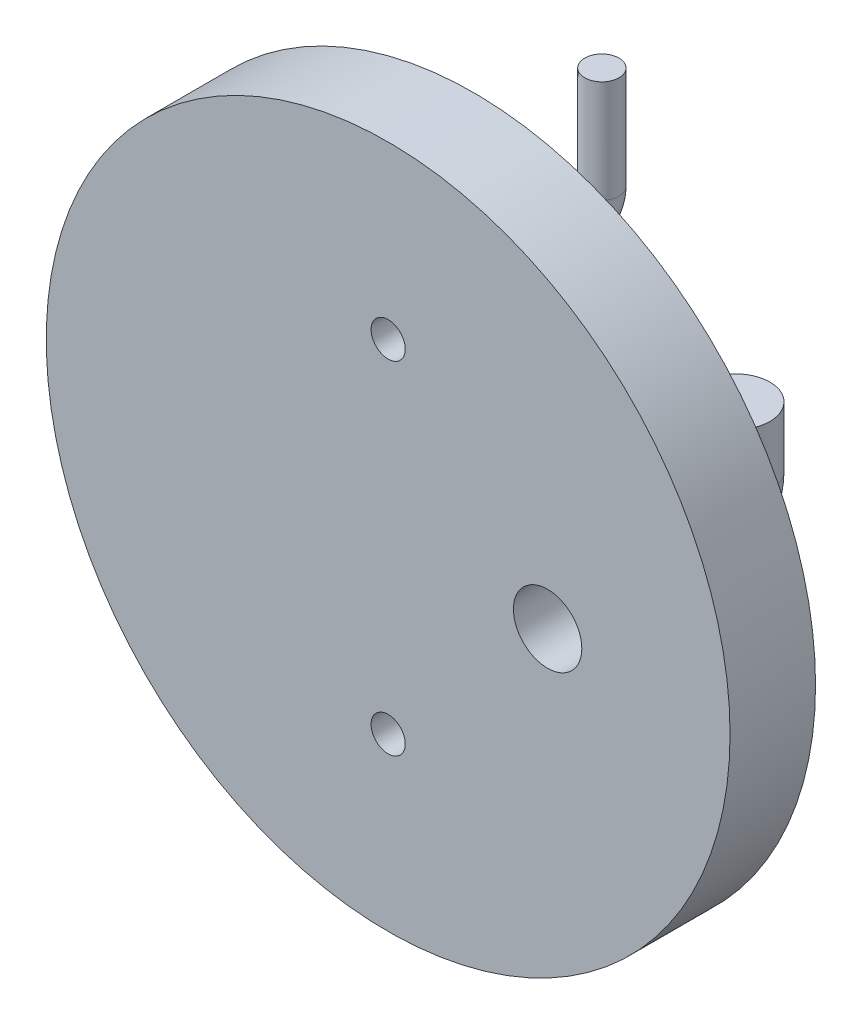
ISO-10303-21;
HEADER;
FILE_DESCRIPTION(('STEP AP214'),'2;1');
FILE_NAME('part.step','',(''),(''),'','','');
FILE_SCHEMA(('AUTOMOTIVE_DESIGN { 1 0 10303 214 1 1 1 1 }'));
ENDSEC;
DATA;
#1=APPLICATION_CONTEXT('core data for automotive mechanical design processes');
#2=APPLICATION_PROTOCOL_DEFINITION('international standard','automotive_design',2000,#1);
#3=PRODUCT_CONTEXT('',#1,'mechanical');
#4=PRODUCT('Part','Part','',(#3));
#5=PRODUCT_RELATED_PRODUCT_CATEGORY('part','',(#4));
#6=PRODUCT_DEFINITION_FORMATION('','',#4);
#7=PRODUCT_DEFINITION_CONTEXT('part definition',#1,'design');
#8=PRODUCT_DEFINITION('design','',#6,#7);
#9=PRODUCT_DEFINITION_SHAPE('','',#8);
#10=(LENGTH_UNIT() NAMED_UNIT(*) SI_UNIT(.MILLI.,.METRE.));
#11=(NAMED_UNIT(*) PLANE_ANGLE_UNIT() SI_UNIT($,.RADIAN.));
#12=(NAMED_UNIT(*) SI_UNIT($,.STERADIAN.) SOLID_ANGLE_UNIT());
#13=UNCERTAINTY_MEASURE_WITH_UNIT(LENGTH_MEASURE(1.E-05),#10,'distance_accuracy_value','');
#14=(GEOMETRIC_REPRESENTATION_CONTEXT(3) GLOBAL_UNCERTAINTY_ASSIGNED_CONTEXT((#13)) GLOBAL_UNIT_ASSIGNED_CONTEXT((#10,
#11,#12)) REPRESENTATION_CONTEXT('',''));
#15=CARTESIAN_POINT('',(0.,0.,0.));
#16=DIRECTION('',(0.,0.,1.));
#17=DIRECTION('',(1.,0.,0.));
#18=AXIS2_PLACEMENT_3D('',#15,#16,#17);
#19=CARTESIAN_POINT('',(18.6528025804478,5.00000000000004,-12.));
#20=DIRECTION('',(0.,1.,0.));
#21=DIRECTION('',(0.,0.,1.));
#22=AXIS2_PLACEMENT_3D('',#19,#20,#21);
#23=CYLINDRICAL_SURFACE('',#22,4.);
#24=CARTESIAN_POINT('',(18.6528025804478,5.00000000000004,-12.));
#25=DIRECTION('',(0.,-1.,0.));
#26=DIRECTION('',(1.,0.,0.));
#27=AXIS2_PLACEMENT_3D('',#24,#25,#26);
#28=CIRCLE('',#27,4.);
#29=CARTESIAN_POINT('',(18.6528025804478,5.00000000000007,-16.));
#30=VERTEX_POINT('',#29);
#31=EDGE_CURVE('E45',#30,#30,#28,.T.);
#32=ORIENTED_EDGE('',*,*,#31,.F.);
#33=EDGE_LOOP('',(#32));
#34=FACE_BOUND('',#33,.T.);
#35=CARTESIAN_POINT('',(18.6528025804478,12.,-12.));
#36=DIRECTION('',(0.,-1.,0.));
#37=DIRECTION('',(1.,0.,0.));
#38=AXIS2_PLACEMENT_3D('',#35,#36,#37);
#39=CIRCLE('',#38,4.);
#40=CARTESIAN_POINT('',(22.6528025804478,12.,-12.));
#41=VERTEX_POINT('',#40);
#42=EDGE_CURVE('E11',#41,#41,#39,.T.);
#43=ORIENTED_EDGE('',*,*,#42,.T.);
#44=EDGE_LOOP('',(#43));
#45=FACE_BOUND('',#44,.T.);
#46=ADVANCED_FACE('F39',(#34,#45),#23,.T.);
#47=CARTESIAN_POINT('',(18.6528025804478,5.,-7.));
#48=DIRECTION('',(1.,0.,0.));
#49=DIRECTION('',(0.,0.,-1.));
#50=AXIS2_PLACEMENT_3D('',#47,#48,#49);
#51=TOROIDAL_SURFACE('',#50,5.,4.);
#52=CARTESIAN_POINT('',(18.6528025804478,0.,-6.99999999999996));
#53=DIRECTION('',(0.,0.,1.));
#54=DIRECTION('',(1.,0.,0.));
#55=AXIS2_PLACEMENT_3D('',#52,#53,#54);
#56=CIRCLE('',#55,4.);
#57=CARTESIAN_POINT('',(18.6528025804478,-4.,-6.99999999999994));
#58=VERTEX_POINT('',#57);
#59=EDGE_CURVE('E49',#58,#58,#56,.T.);
#60=CARTESIAN_POINT('',(18.6528025804478,5.,-7.));
#61=DIRECTION('',(1.,0.,0.));
#62=DIRECTION('',(0.,0.,-1.));
#63=AXIS2_PLACEMENT_3D('',#60,#61,#62);
#64=CIRCLE('',#63,9.);
#65=EDGE_CURVE('',#58,#30,#64,.T.);
#66=ORIENTED_EDGE('',*,*,#59,.F.);
#67=ORIENTED_EDGE('',*,*,#31,.T.);
#68=ORIENTED_EDGE('',*,*,#65,.T.);
#69=ORIENTED_EDGE('',*,*,#65,.F.);
#70=EDGE_LOOP('',(#66,#68,#67,#69));
#71=FACE_BOUND('',#70,.T.);
#72=ADVANCED_FACE('F64',(#71),#51,.T.);
#73=CARTESIAN_POINT('',(18.6528025804478,0.,-6.99999999999996));
#74=DIRECTION('',(0.,0.,1.));
#75=DIRECTION('',(1.,0.,0.));
#76=AXIS2_PLACEMENT_3D('',#73,#74,#75);
#77=CYLINDRICAL_SURFACE('',#76,4.);
#78=ORIENTED_EDGE('',*,*,#59,.T.);
#79=EDGE_LOOP('',(#78));
#80=FACE_BOUND('',#79,.T.);
#81=CARTESIAN_POINT('',(18.6528025804478,0.,0.));
#82=DIRECTION('',(0.,0.,1.));
#83=DIRECTION('',(1.,0.,0.));
#84=AXIS2_PLACEMENT_3D('',#81,#82,#83);
#85=CIRCLE('',#84,4.);
#86=CARTESIAN_POINT('',(22.6528025804478,0.,0.));
#87=VERTEX_POINT('',#86);
#88=EDGE_CURVE('E53',#87,#87,#85,.T.);
#89=ORIENTED_EDGE('',*,*,#88,.F.);
#90=EDGE_LOOP('',(#89));
#91=FACE_BOUND('',#90,.T.);
#92=ADVANCED_FACE('F61',(#80,#91),#77,.T.);
#93=CARTESIAN_POINT('',(18.6528025804478,12.,-12.));
#94=DIRECTION('',(0.,-1.,0.));
#95=DIRECTION('',(1.,0.,0.));
#96=AXIS2_PLACEMENT_3D('',#93,#94,#95);
#97=PLANE('',#96);
#98=ORIENTED_EDGE('',*,*,#42,.F.);
#99=EDGE_LOOP('',(#98));
#100=FACE_BOUND('',#99,.T.);
#101=ADVANCED_FACE('F63',(#100),#97,.F.);
#102=CARTESIAN_POINT('',(18.6528025804478,0.,0.));
#103=DIRECTION('',(0.,0.,1.));
#104=DIRECTION('',(1.,0.,0.));
#105=AXIS2_PLACEMENT_3D('',#102,#103,#104);
#106=PLANE('',#105);
#107=ORIENTED_EDGE('',*,*,#88,.T.);
#108=EDGE_LOOP('',(#107));
#109=FACE_BOUND('',#108,.T.);
#110=ADVANCED_FACE('F59',(#109),#106,.T.);
#111=CLOSED_SHELL('',(#46,#72,#92,#101,#110));
#112=MANIFOLD_SOLID_BREP('B2',#111);
#113=CARTESIAN_POINT('',(0.,23.,-15.));
#114=DIRECTION('',(0.,1.,0.));
#115=DIRECTION('',(0.,0.,1.));
#116=AXIS2_PLACEMENT_3D('',#113,#114,#115);
#117=CYLINDRICAL_SURFACE('',#116,2.);
#118=CARTESIAN_POINT('',(0.,23.,-15.));
#119=DIRECTION('',(0.,1.,0.));
#120=DIRECTION('',(-1.,0.,0.));
#121=AXIS2_PLACEMENT_3D('',#118,#119,#120);
#122=CIRCLE('',#121,2.);
#123=CARTESIAN_POINT('',(0.,23.,-17.));
#124=VERTEX_POINT('',#123);
#125=EDGE_CURVE('E123',#124,#124,#122,.T.);
#126=ORIENTED_EDGE('',*,*,#125,.T.);
#127=EDGE_LOOP('',(#126));
#128=FACE_BOUND('',#127,.T.);
#129=CARTESIAN_POINT('',(0.,35.,-15.));
#130=DIRECTION('',(0.,1.,0.));
#131=DIRECTION('',(-1.,0.,0.));
#132=AXIS2_PLACEMENT_3D('',#129,#130,#131);
#133=CIRCLE('',#132,2.);
#134=CARTESIAN_POINT('',(-2.,35.,-15.));
#135=VERTEX_POINT('',#134);
#136=EDGE_CURVE('E38',#135,#135,#133,.T.);
#137=ORIENTED_EDGE('',*,*,#136,.F.);
#138=EDGE_LOOP('',(#137));
#139=FACE_BOUND('',#138,.T.);
#140=ADVANCED_FACE('F117',(#128,#139),#117,.T.);
#141=CARTESIAN_POINT('',(0.,23.,-12.));
#142=DIRECTION('',(1.,0.,0.));
#143=DIRECTION('',(0.,0.,-1.));
#144=AXIS2_PLACEMENT_3D('',#141,#142,#143);
#145=TOROIDAL_SURFACE('',#144,3.,2.);
#146=CARTESIAN_POINT('',(0.,20.,-12.));
#147=DIRECTION('',(0.,0.,-1.));
#148=DIRECTION('',(-1.,0.,0.));
#149=AXIS2_PLACEMENT_3D('',#146,#147,#148);
#150=CIRCLE('',#149,2.);
#151=CARTESIAN_POINT('',(0.,18.,-12.));
#152=VERTEX_POINT('',#151);
#153=EDGE_CURVE('E127',#152,#152,#150,.T.);
#154=CARTESIAN_POINT('',(0.,23.,-12.));
#155=DIRECTION('',(1.,0.,0.));
#156=DIRECTION('',(0.,0.,-1.));
#157=AXIS2_PLACEMENT_3D('',#154,#155,#156);
#158=CIRCLE('',#157,5.);
#159=EDGE_CURVE('',#152,#124,#158,.T.);
#160=ORIENTED_EDGE('',*,*,#153,.T.);
#161=ORIENTED_EDGE('',*,*,#125,.F.);
#162=ORIENTED_EDGE('',*,*,#159,.T.);
#163=ORIENTED_EDGE('',*,*,#159,.F.);
#164=EDGE_LOOP('',(#160,#162,#161,#163));
#165=FACE_BOUND('',#164,.T.);
#166=ADVANCED_FACE('F149',(#165),#145,.T.);
#167=CARTESIAN_POINT('',(0.,20.,-12.));
#168=DIRECTION('',(0.,0.,1.));
#169=DIRECTION('',(0.,-1.,0.));
#170=AXIS2_PLACEMENT_3D('',#167,#168,#169);
#171=CYLINDRICAL_SURFACE('',#170,2.);
#172=CARTESIAN_POINT('',(0.,20.,0.));
#173=DIRECTION('',(0.,0.,-1.));
#174=DIRECTION('',(-1.,0.,0.));
#175=AXIS2_PLACEMENT_3D('',#172,#173,#174);
#176=CIRCLE('',#175,2.);
#177=CARTESIAN_POINT('',(0.,18.,0.));
#178=VERTEX_POINT('',#177);
#179=EDGE_CURVE('E131',#178,#178,#176,.T.);
#180=CARTESIAN_POINT('',(0.,18.,-12.));
#181=CARTESIAN_POINT('',(0.,18.,-11.875));
#182=CARTESIAN_POINT('',(0.,18.,-11.75));
#183=CARTESIAN_POINT('',(0.,18.,-11.5));
#184=CARTESIAN_POINT('',(0.,18.,-11.375));
#185=CARTESIAN_POINT('',(0.,18.,-11.125));
#186=CARTESIAN_POINT('',(0.,18.,-11.));
#187=CARTESIAN_POINT('',(0.,18.,-10.75));
#188=CARTESIAN_POINT('',(0.,18.,-10.625));
#189=CARTESIAN_POINT('',(0.,18.,-10.375));
#190=CARTESIAN_POINT('',(0.,18.,-10.25));
#191=CARTESIAN_POINT('',(0.,18.,-10.));
#192=CARTESIAN_POINT('',(0.,18.,-9.875));
#193=CARTESIAN_POINT('',(0.,18.,-9.625));
#194=CARTESIAN_POINT('',(0.,18.,-9.5));
#195=CARTESIAN_POINT('',(0.,18.,-9.25));
#196=CARTESIAN_POINT('',(0.,18.,-9.125));
#197=CARTESIAN_POINT('',(0.,18.,-8.875));
#198=CARTESIAN_POINT('',(0.,18.,-8.75));
#199=CARTESIAN_POINT('',(0.,18.,-8.5));
#200=CARTESIAN_POINT('',(0.,18.,-8.375));
#201=CARTESIAN_POINT('',(0.,18.,-8.125));
#202=CARTESIAN_POINT('',(0.,18.,-8.));
#203=CARTESIAN_POINT('',(0.,18.,-7.75));
#204=CARTESIAN_POINT('',(0.,18.,-7.625));
#205=CARTESIAN_POINT('',(0.,18.,-7.375));
#206=CARTESIAN_POINT('',(0.,18.,-7.25));
#207=CARTESIAN_POINT('',(0.,18.,-7.));
#208=CARTESIAN_POINT('',(0.,18.,-6.875));
#209=CARTESIAN_POINT('',(0.,18.,-6.625));
#210=CARTESIAN_POINT('',(0.,18.,-6.5));
#211=CARTESIAN_POINT('',(0.,18.,-6.25));
#212=CARTESIAN_POINT('',(0.,18.,-6.125));
#213=CARTESIAN_POINT('',(0.,18.,-5.875));
#214=CARTESIAN_POINT('',(0.,18.,-5.75));
#215=CARTESIAN_POINT('',(0.,18.,-5.5));
#216=CARTESIAN_POINT('',(0.,18.,-5.375));
#217=CARTESIAN_POINT('',(0.,18.,-5.125));
#218=CARTESIAN_POINT('',(0.,18.,-5.));
#219=CARTESIAN_POINT('',(0.,18.,-4.75));
#220=CARTESIAN_POINT('',(0.,18.,-4.625));
#221=CARTESIAN_POINT('',(0.,18.,-4.375));
#222=CARTESIAN_POINT('',(0.,18.,-4.25));
#223=CARTESIAN_POINT('',(0.,18.,-4.));
#224=CARTESIAN_POINT('',(0.,18.,-3.875));
#225=CARTESIAN_POINT('',(0.,18.,-3.625));
#226=CARTESIAN_POINT('',(0.,18.,-3.5));
#227=CARTESIAN_POINT('',(0.,18.,-3.25));
#228=CARTESIAN_POINT('',(0.,18.,-3.125));
#229=CARTESIAN_POINT('',(0.,18.,-2.875));
#230=CARTESIAN_POINT('',(0.,18.,-2.75));
#231=CARTESIAN_POINT('',(0.,18.,-2.5));
#232=CARTESIAN_POINT('',(0.,18.,-2.375));
#233=CARTESIAN_POINT('',(0.,18.,-2.125));
#234=CARTESIAN_POINT('',(0.,18.,-2.));
#235=CARTESIAN_POINT('',(0.,18.,-1.75));
#236=CARTESIAN_POINT('',(0.,18.,-1.625));
#237=CARTESIAN_POINT('',(0.,18.,-1.375));
#238=CARTESIAN_POINT('',(0.,18.,-1.25));
#239=CARTESIAN_POINT('',(0.,18.,-1.));
#240=CARTESIAN_POINT('',(0.,18.,-0.875000000000001));
#241=CARTESIAN_POINT('',(0.,18.,-0.625000000000001));
#242=CARTESIAN_POINT('',(0.,18.,-0.5));
#243=CARTESIAN_POINT('',(0.,18.,-0.25));
#244=CARTESIAN_POINT('',(0.,18.,-0.125));
#245=CARTESIAN_POINT('',(0.,18.,0.));
#246=B_SPLINE_CURVE_WITH_KNOTS('',3,(#180,#181,#182,#183,#184,#185,#186,#187,#188,#189,#190,
#191,#192,#193,#194,#195,#196,#197,#198,#199,#200,#201,#202,#203,#204,#205,#206,#207,#208,#209,
#210,#211,#212,#213,#214,#215,#216,#217,#218,#219,#220,#221,#222,#223,#224,#225,#226,#227,#228,
#229,#230,#231,#232,#233,#234,#235,#236,#237,#238,#239,#240,#241,#242,#243,#244,#245),
.UNSPECIFIED.,.F.,.F.,(4,2,2,2,2,2,2,2,2,2,2,2,2,2,2,2,2,2,2,2,2,2,2,2,2,2,2,2,2,2,2,2,4),(0.,
0.375,0.750000000000001,1.125,1.5,1.875,2.25,2.625,3.,3.375,3.75,4.125,4.5,4.875,5.25,5.625,6.,
6.375,6.75,7.125,7.5,7.875,8.25,8.625,9.,9.375,9.75,10.125,10.5,10.875,11.25,11.625,12.),.UNSPECIFIED.);
#247=EDGE_CURVE('BSEAM137',#152,#178,#246,.T.);
#248=ORIENTED_EDGE('',*,*,#153,.F.);
#249=ORIENTED_EDGE('',*,*,#179,.T.);
#250=ORIENTED_EDGE('',*,*,#247,.T.);
#251=ORIENTED_EDGE('',*,*,#247,.F.);
#252=EDGE_LOOP('',(#248,#250,#249,#251));
#253=FACE_BOUND('',#252,.T.);
#254=ADVANCED_FACE('F137',(#253),#171,.T.);
#255=CARTESIAN_POINT('',(0.,35.,-15.));
#256=DIRECTION('',(0.,1.,0.));
#257=DIRECTION('',(-1.,0.,0.));
#258=AXIS2_PLACEMENT_3D('',#255,#256,#257);
#259=PLANE('',#258);
#260=ORIENTED_EDGE('',*,*,#136,.T.);
#261=EDGE_LOOP('',(#260));
#262=FACE_BOUND('',#261,.T.);
#263=ADVANCED_FACE('F141',(#262),#259,.T.);
#264=CARTESIAN_POINT('',(0.,20.,0.));
#265=DIRECTION('',(0.,0.,-1.));
#266=DIRECTION('',(-1.,0.,0.));
#267=AXIS2_PLACEMENT_3D('',#264,#265,#266);
#268=PLANE('',#267);
#269=ORIENTED_EDGE('',*,*,#179,.F.);
#270=EDGE_LOOP('',(#269));
#271=FACE_BOUND('',#270,.T.);
#272=ADVANCED_FACE('F139',(#271),#268,.F.);
#273=CLOSED_SHELL('',(#140,#166,#254,#263,#272));
#274=MANIFOLD_SOLID_BREP('B6',#273);
#275=CARTESIAN_POINT('',(0.,-23.,-15.));
#276=DIRECTION('',(0.,-1.,0.));
#277=DIRECTION('',(0.,0.,-1.));
#278=AXIS2_PLACEMENT_3D('',#275,#276,#277);
#279=CYLINDRICAL_SURFACE('',#278,2.);
#280=CARTESIAN_POINT('',(0.,-23.,-15.));
#281=DIRECTION('',(0.,1.,0.));
#282=DIRECTION('',(1.,0.,0.));
#283=AXIS2_PLACEMENT_3D('',#280,#281,#282);
#284=CIRCLE('',#283,2.);
#285=CARTESIAN_POINT('',(0.,-23.,-17.));
#286=VERTEX_POINT('',#285);
#287=EDGE_CURVE('E200',#286,#286,#284,.T.);
#288=ORIENTED_EDGE('',*,*,#287,.F.);
#289=EDGE_LOOP('',(#288));
#290=FACE_BOUND('',#289,.T.);
#291=CARTESIAN_POINT('',(0.,-35.,-15.));
#292=DIRECTION('',(0.,1.,0.));
#293=DIRECTION('',(1.,0.,0.));
#294=AXIS2_PLACEMENT_3D('',#291,#292,#293);
#295=CIRCLE('',#294,2.);
#296=CARTESIAN_POINT('',(2.,-35.,-15.));
#297=VERTEX_POINT('',#296);
#298=EDGE_CURVE('E116',#297,#297,#295,.T.);
#299=ORIENTED_EDGE('',*,*,#298,.T.);
#300=EDGE_LOOP('',(#299));
#301=FACE_BOUND('',#300,.T.);
#302=ADVANCED_FACE('F194',(#290,#301),#279,.T.);
#303=CARTESIAN_POINT('',(0.,-23.,-12.));
#304=DIRECTION('',(-1.,0.,0.));
#305=DIRECTION('',(0.,0.,1.));
#306=AXIS2_PLACEMENT_3D('',#303,#304,#305);
#307=TOROIDAL_SURFACE('',#306,3.,2.);
#308=CARTESIAN_POINT('',(0.,-20.,-12.));
#309=DIRECTION('',(0.,0.,1.));
#310=DIRECTION('',(1.,0.,0.));
#311=AXIS2_PLACEMENT_3D('',#308,#309,#310);
#312=CIRCLE('',#311,2.);
#313=CARTESIAN_POINT('',(0.,-18.,-12.));
#314=VERTEX_POINT('',#313);
#315=EDGE_CURVE('E204',#314,#314,#312,.T.);
#316=CARTESIAN_POINT('',(0.,-23.,-12.));
#317=DIRECTION('',(-1.,0.,0.));
#318=DIRECTION('',(0.,0.,1.));
#319=AXIS2_PLACEMENT_3D('',#316,#317,#318);
#320=CIRCLE('',#319,5.);
#321=EDGE_CURVE('',#314,#286,#320,.T.);
#322=ORIENTED_EDGE('',*,*,#315,.F.);
#323=ORIENTED_EDGE('',*,*,#287,.T.);
#324=ORIENTED_EDGE('',*,*,#321,.T.);
#325=ORIENTED_EDGE('',*,*,#321,.F.);
#326=EDGE_LOOP('',(#322,#324,#323,#325));
#327=FACE_BOUND('',#326,.T.);
#328=ADVANCED_FACE('F219',(#327),#307,.T.);
#329=CARTESIAN_POINT('',(0.,-20.,-12.));
#330=DIRECTION('',(0.,0.,1.));
#331=DIRECTION('',(1.,0.,0.));
#332=AXIS2_PLACEMENT_3D('',#329,#330,#331);
#333=CYLINDRICAL_SURFACE('',#332,2.);
#334=ORIENTED_EDGE('',*,*,#315,.T.);
#335=EDGE_LOOP('',(#334));
#336=FACE_BOUND('',#335,.T.);
#337=CARTESIAN_POINT('',(0.,-20.,0.));
#338=DIRECTION('',(0.,0.,1.));
#339=DIRECTION('',(1.,0.,0.));
#340=AXIS2_PLACEMENT_3D('',#337,#338,#339);
#341=CIRCLE('',#340,2.);
#342=CARTESIAN_POINT('',(2.,-20.,0.));
#343=VERTEX_POINT('',#342);
#344=EDGE_CURVE('E208',#343,#343,#341,.T.);
#345=ORIENTED_EDGE('',*,*,#344,.F.);
#346=EDGE_LOOP('',(#345));
#347=FACE_BOUND('',#346,.T.);
#348=ADVANCED_FACE('F216',(#336,#347),#333,.T.);
#349=CARTESIAN_POINT('',(0.,-35.,-15.));
#350=DIRECTION('',(0.,1.,0.));
#351=DIRECTION('',(1.,0.,0.));
#352=AXIS2_PLACEMENT_3D('',#349,#350,#351);
#353=PLANE('',#352);
#354=ORIENTED_EDGE('',*,*,#298,.F.);
#355=EDGE_LOOP('',(#354));
#356=FACE_BOUND('',#355,.T.);
#357=ADVANCED_FACE('F218',(#356),#353,.F.);
#358=CARTESIAN_POINT('',(0.,-20.,0.));
#359=DIRECTION('',(0.,0.,1.));
#360=DIRECTION('',(1.,0.,0.));
#361=AXIS2_PLACEMENT_3D('',#358,#359,#360);
#362=PLANE('',#361);
#363=ORIENTED_EDGE('',*,*,#344,.T.);
#364=EDGE_LOOP('',(#363));
#365=FACE_BOUND('',#364,.T.);
#366=ADVANCED_FACE('F214',(#365),#362,.T.);
#367=CLOSED_SHELL('',(#302,#328,#348,#357,#366));
#368=MANIFOLD_SOLID_BREP('B33',#367);
#369=CARTESIAN_POINT('',(0.,0.,10.));
#370=DIRECTION('',(0.,0.,1.));
#371=DIRECTION('',(1.,0.,0.));
#372=AXIS2_PLACEMENT_3D('',#369,#370,#371);
#373=PLANE('',#372);
#374=CARTESIAN_POINT('',(0.,-20.,10.));
#375=DIRECTION('',(0.,0.,1.));
#376=DIRECTION('',(1.,0.,0.));
#377=AXIS2_PLACEMENT_3D('',#374,#375,#376);
#378=CIRCLE('',#377,2.);
#379=CARTESIAN_POINT('',(2.,-20.,10.));
#380=VERTEX_POINT('',#379);
#381=EDGE_CURVE('E280',#380,#380,#378,.T.);
#382=ORIENTED_EDGE('',*,*,#381,.F.);
#383=EDGE_LOOP('',(#382));
#384=FACE_BOUND('',#383,.T.);
#385=CARTESIAN_POINT('',(0.,0.,10.));
#386=DIRECTION('',(0.,0.,1.));
#387=DIRECTION('',(1.,0.,0.));
#388=AXIS2_PLACEMENT_3D('',#385,#386,#387);
#389=CIRCLE('',#388,40.);
#390=CARTESIAN_POINT('',(40.,0.,10.));
#391=VERTEX_POINT('',#390);
#392=EDGE_CURVE('E193',#391,#391,#389,.T.);
#393=ORIENTED_EDGE('',*,*,#392,.T.);
#394=EDGE_LOOP('',(#393));
#395=FACE_BOUND('',#394,.T.);
#396=CARTESIAN_POINT('',(0.,20.,10.));
#397=DIRECTION('',(0.,0.,1.));
#398=DIRECTION('',(1.,0.,0.));
#399=AXIS2_PLACEMENT_3D('',#396,#397,#398);
#400=CIRCLE('',#399,2.);
#401=CARTESIAN_POINT('',(2.,20.,10.));
#402=VERTEX_POINT('',#401);
#403=EDGE_CURVE('E275',#402,#402,#400,.T.);
#404=ORIENTED_EDGE('',*,*,#403,.F.);
#405=EDGE_LOOP('',(#404));
#406=FACE_BOUND('',#405,.T.);
#407=CARTESIAN_POINT('',(18.6528025804478,0.,10.));
#408=DIRECTION('',(0.,0.,1.));
#409=DIRECTION('',(1.,0.,0.));
#410=AXIS2_PLACEMENT_3D('',#407,#408,#409);
#411=CIRCLE('',#410,4.);
#412=CARTESIAN_POINT('',(22.6528025804478,0.,10.));
#413=VERTEX_POINT('',#412);
#414=EDGE_CURVE('E286',#413,#413,#411,.T.);
#415=ORIENTED_EDGE('',*,*,#414,.F.);
#416=EDGE_LOOP('',(#415));
#417=FACE_BOUND('',#416,.T.);
#418=ADVANCED_FACE('F264',(#384,#395,#406,#417),#373,.T.);
#419=CARTESIAN_POINT('',(0.,0.,0.));
#420=DIRECTION('',(0.,0.,1.));
#421=DIRECTION('',(1.,0.,0.));
#422=AXIS2_PLACEMENT_3D('',#419,#420,#421);
#423=PLANE('',#422);
#424=CARTESIAN_POINT('',(0.,0.,0.));
#425=DIRECTION('',(0.,0.,1.));
#426=DIRECTION('',(1.,0.,0.));
#427=AXIS2_PLACEMENT_3D('',#424,#425,#426);
#428=CIRCLE('',#427,40.);
#429=CARTESIAN_POINT('',(40.,0.,0.));
#430=VERTEX_POINT('',#429);
#431=EDGE_CURVE('E268',#430,#430,#428,.T.);
#432=ORIENTED_EDGE('',*,*,#431,.F.);
#433=EDGE_LOOP('',(#432));
#434=FACE_BOUND('',#433,.T.);
#435=CARTESIAN_POINT('',(0.,20.,0.));
#436=DIRECTION('',(0.,0.,1.));
#437=DIRECTION('',(1.,0.,0.));
#438=AXIS2_PLACEMENT_3D('',#435,#436,#437);
#439=CIRCLE('',#438,2.);
#440=CARTESIAN_POINT('',(2.,20.,0.));
#441=VERTEX_POINT('',#440);
#442=EDGE_CURVE('E277',#441,#441,#439,.T.);
#443=ORIENTED_EDGE('',*,*,#442,.T.);
#444=EDGE_LOOP('',(#443));
#445=FACE_BOUND('',#444,.T.);
#446=CARTESIAN_POINT('',(0.,-20.,0.));
#447=DIRECTION('',(0.,0.,1.));
#448=DIRECTION('',(1.,0.,0.));
#449=AXIS2_PLACEMENT_3D('',#446,#447,#448);
#450=CIRCLE('',#449,2.);
#451=CARTESIAN_POINT('',(2.,-20.,0.));
#452=VERTEX_POINT('',#451);
#453=EDGE_CURVE('E283',#452,#452,#450,.T.);
#454=ORIENTED_EDGE('',*,*,#453,.T.);
#455=EDGE_LOOP('',(#454));
#456=FACE_BOUND('',#455,.T.);
#457=CARTESIAN_POINT('',(18.6528025804478,0.,0.));
#458=DIRECTION('',(0.,0.,1.));
#459=DIRECTION('',(1.,0.,0.));
#460=AXIS2_PLACEMENT_3D('',#457,#458,#459);
#461=CIRCLE('',#460,4.);
#462=CARTESIAN_POINT('',(22.6528025804478,0.,0.));
#463=VERTEX_POINT('',#462);
#464=EDGE_CURVE('E289',#463,#463,#461,.T.);
#465=ORIENTED_EDGE('',*,*,#464,.T.);
#466=EDGE_LOOP('',(#465));
#467=FACE_BOUND('',#466,.T.);
#468=ADVANCED_FACE('F299',(#434,#445,#456,#467),#423,.F.);
#469=CARTESIAN_POINT('',(0.,0.,10.));
#470=DIRECTION('',(0.,0.,-1.));
#471=DIRECTION('',(-1.,0.,0.));
#472=AXIS2_PLACEMENT_3D('',#469,#470,#471);
#473=CYLINDRICAL_SURFACE('',#472,40.);
#474=ORIENTED_EDGE('',*,*,#392,.F.);
#475=EDGE_LOOP('',(#474));
#476=FACE_BOUND('',#475,.T.);
#477=ORIENTED_EDGE('',*,*,#431,.T.);
#478=EDGE_LOOP('',(#477));
#479=FACE_BOUND('',#478,.T.);
#480=ADVANCED_FACE('F266',(#476,#479),#473,.T.);
#481=CARTESIAN_POINT('',(0.,20.,10.));
#482=DIRECTION('',(0.,0.,-1.));
#483=DIRECTION('',(-1.,0.,0.));
#484=AXIS2_PLACEMENT_3D('',#481,#482,#483);
#485=CYLINDRICAL_SURFACE('',#484,2.);
#486=ORIENTED_EDGE('',*,*,#403,.T.);
#487=EDGE_LOOP('',(#486));
#488=FACE_BOUND('',#487,.T.);
#489=ORIENTED_EDGE('',*,*,#442,.F.);
#490=EDGE_LOOP('',(#489));
#491=FACE_BOUND('',#490,.T.);
#492=ADVANCED_FACE('F308',(#488,#491),#485,.F.);
#493=CARTESIAN_POINT('',(0.,-20.,10.));
#494=DIRECTION('',(0.,0.,-1.));
#495=DIRECTION('',(-1.,0.,0.));
#496=AXIS2_PLACEMENT_3D('',#493,#494,#495);
#497=CYLINDRICAL_SURFACE('',#496,2.);
#498=ORIENTED_EDGE('',*,*,#381,.T.);
#499=EDGE_LOOP('',(#498));
#500=FACE_BOUND('',#499,.T.);
#501=ORIENTED_EDGE('',*,*,#453,.F.);
#502=EDGE_LOOP('',(#501));
#503=FACE_BOUND('',#502,.T.);
#504=ADVANCED_FACE('F311',(#500,#503),#497,.F.);
#505=CARTESIAN_POINT('',(18.6528025804478,0.,10.));
#506=DIRECTION('',(0.,0.,-1.));
#507=DIRECTION('',(-1.,0.,0.));
#508=AXIS2_PLACEMENT_3D('',#505,#506,#507);
#509=CYLINDRICAL_SURFACE('',#508,4.);
#510=ORIENTED_EDGE('',*,*,#414,.T.);
#511=EDGE_LOOP('',(#510));
#512=FACE_BOUND('',#511,.T.);
#513=ORIENTED_EDGE('',*,*,#464,.F.);
#514=EDGE_LOOP('',(#513));
#515=FACE_BOUND('',#514,.T.);
#516=ADVANCED_FACE('F295',(#512,#515),#509,.F.);
#517=CLOSED_SHELL('',(#418,#468,#480,#492,#504,#516));
#518=MANIFOLD_SOLID_BREP('B111',#517);
#519=ADVANCED_BREP_SHAPE_REPRESENTATION('',(#18,#112,#274,#368,#518),#14);
#520=SHAPE_DEFINITION_REPRESENTATION(#9,#519);
ENDSEC;
END-ISO-10303-21;
